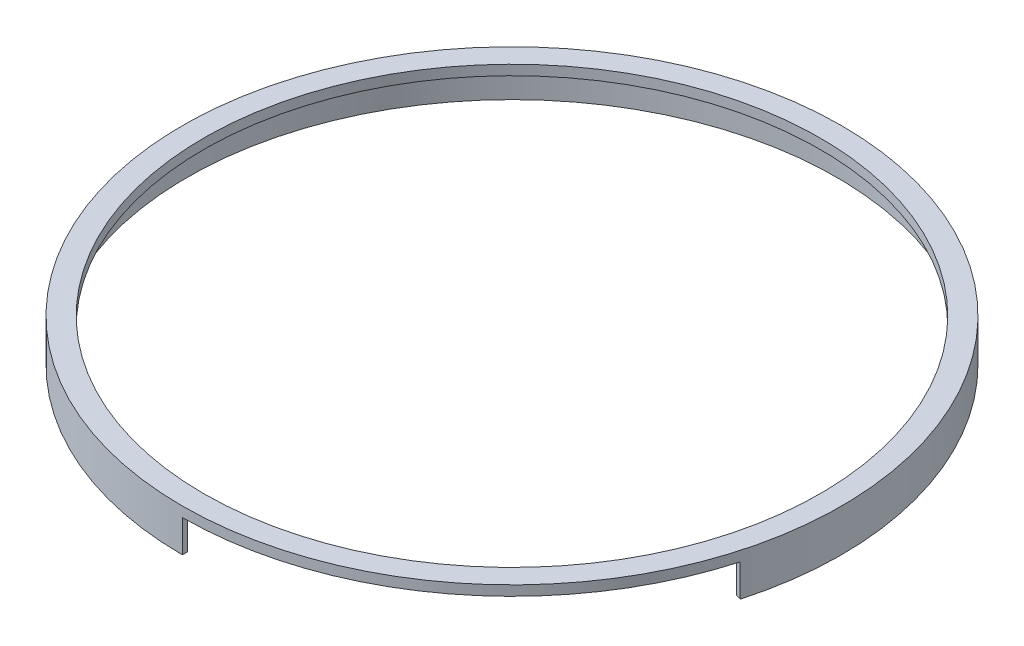
ISO-10303-21;
HEADER;
FILE_DESCRIPTION(('STEP AP214'),'2;1');
FILE_NAME('part.step','',(''),(''),'','','');
FILE_SCHEMA(('AUTOMOTIVE_DESIGN { 1 0 10303 214 1 1 1 1 }'));
ENDSEC;
DATA;
#1=APPLICATION_CONTEXT('core data for automotive mechanical design processes');
#2=APPLICATION_PROTOCOL_DEFINITION('international standard','automotive_design',2000,#1);
#3=PRODUCT_CONTEXT('',#1,'mechanical');
#4=PRODUCT('Part','Part','',(#3));
#5=PRODUCT_RELATED_PRODUCT_CATEGORY('part','',(#4));
#6=PRODUCT_DEFINITION_FORMATION('','',#4);
#7=PRODUCT_DEFINITION_CONTEXT('part definition',#1,'design');
#8=PRODUCT_DEFINITION('design','',#6,#7);
#9=PRODUCT_DEFINITION_SHAPE('','',#8);
#10=(LENGTH_UNIT() NAMED_UNIT(*) SI_UNIT(.MILLI.,.METRE.));
#11=(NAMED_UNIT(*) PLANE_ANGLE_UNIT() SI_UNIT($,.RADIAN.));
#12=(NAMED_UNIT(*) SI_UNIT($,.STERADIAN.) SOLID_ANGLE_UNIT());
#13=UNCERTAINTY_MEASURE_WITH_UNIT(LENGTH_MEASURE(1.E-05),#10,'distance_accuracy_value','');
#14=(GEOMETRIC_REPRESENTATION_CONTEXT(3) GLOBAL_UNCERTAINTY_ASSIGNED_CONTEXT((#13)) GLOBAL_UNIT_ASSIGNED_CONTEXT((#10,
#11,#12)) REPRESENTATION_CONTEXT('',''));
#15=CARTESIAN_POINT('',(0.,0.,0.));
#16=DIRECTION('',(0.,0.,1.));
#17=DIRECTION('',(1.,0.,0.));
#18=AXIS2_PLACEMENT_3D('',#15,#16,#17);
#19=CARTESIAN_POINT('',(0.,0.,0.));
#20=DIRECTION('',(0.,1.,0.));
#21=DIRECTION('',(0.,0.,1.));
#22=AXIS2_PLACEMENT_3D('',#19,#20,#21);
#23=PLANE('',#22);
#24=CARTESIAN_POINT('',(0.,0.,0.));
#25=DIRECTION('',(0.,1.,0.));
#26=DIRECTION('',(0.,0.,1.));
#27=AXIS2_PLACEMENT_3D('',#24,#25,#26);
#28=CIRCLE('',#27,62.);
#29=CARTESIAN_POINT('',(0.,0.,62.));
#30=VERTEX_POINT('',#29);
#31=EDGE_CURVE('E80',#30,#30,#28,.T.);
#32=ORIENTED_EDGE('',*,*,#31,.T.);
#33=EDGE_LOOP('',(#32));
#34=FACE_BOUND('',#33,.T.);
#35=DIRECTION('',(-0.962787641919989,0.,-0.270259054549792));
#36=VECTOR('',#35,1.);
#37=CARTESIAN_POINT('',(0.,0.,0.));
#38=LINE('',#37,#36);
#39=CARTESIAN_POINT('',(63.8328206592953,0.,17.9181753166513));
#40=VERTEX_POINT('',#39);
#41=CARTESIAN_POINT('',(62.8700330173753,0.,17.6479162621015));
#42=VERTEX_POINT('',#41);
#43=EDGE_CURVE('E95',#40,#42,#38,.T.);
#44=ORIENTED_EDGE('',*,*,#43,.F.);
#45=CARTESIAN_POINT('',(0.,0.,0.));
#46=DIRECTION('',(0.,1.,0.));
#47=DIRECTION('',(0.,0.,1.));
#48=AXIS2_PLACEMENT_3D('',#45,#46,#47);
#49=CIRCLE('',#48,66.3);
#50=CARTESIAN_POINT('',(0.,0.,66.3));
#51=VERTEX_POINT('',#50);
#52=EDGE_CURVE('E39',#51,#40,#49,.T.);
#53=ORIENTED_EDGE('',*,*,#52,.F.);
#54=DIRECTION('',(0.,0.,1.));
#55=VECTOR('',#54,1.);
#56=CARTESIAN_POINT('',(0.,0.,0.));
#57=LINE('',#56,#55);
#58=CARTESIAN_POINT('',(0.,0.,65.3));
#59=VERTEX_POINT('',#58);
#60=EDGE_CURVE('E55',#59,#51,#57,.T.);
#61=ORIENTED_EDGE('',*,*,#60,.F.);
#62=CARTESIAN_POINT('',(0.,0.,0.));
#63=DIRECTION('',(0.,-1.,0.));
#64=DIRECTION('',(0.,0.,-1.));
#65=AXIS2_PLACEMENT_3D('',#62,#63,#64);
#66=CIRCLE('',#65,65.3);
#67=EDGE_CURVE('E50',#59,#42,#66,.T.);
#68=ORIENTED_EDGE('',*,*,#67,.T.);
#69=EDGE_LOOP('',(#44,#53,#61,#68));
#70=FACE_BOUND('',#69,.T.);
#71=ADVANCED_FACE('F35',(#34,#70),#23,.F.);
#72=CARTESIAN_POINT('',(0.,2.,0.));
#73=DIRECTION('',(0.,1.,0.));
#74=DIRECTION('',(0.,0.,1.));
#75=AXIS2_PLACEMENT_3D('',#72,#73,#74);
#76=PLANE('',#75);
#77=CARTESIAN_POINT('',(0.,2.,0.));
#78=DIRECTION('',(0.,1.,0.));
#79=DIRECTION('',(0.,0.,1.));
#80=AXIS2_PLACEMENT_3D('',#77,#78,#79);
#81=CIRCLE('',#80,66.3);
#82=CARTESIAN_POINT('',(0.,2.,66.3));
#83=VERTEX_POINT('',#82);
#84=EDGE_CURVE('E11',#83,#83,#81,.T.);
#85=ORIENTED_EDGE('',*,*,#84,.T.);
#86=EDGE_LOOP('',(#85));
#87=FACE_BOUND('',#86,.T.);
#88=CARTESIAN_POINT('',(0.,2.,0.));
#89=DIRECTION('',(0.,1.,0.));
#90=DIRECTION('',(0.,0.,1.));
#91=AXIS2_PLACEMENT_3D('',#88,#89,#90);
#92=CIRCLE('',#91,62.);
#93=CARTESIAN_POINT('',(0.,2.,62.));
#94=VERTEX_POINT('',#93);
#95=EDGE_CURVE('E110',#94,#94,#92,.T.);
#96=ORIENTED_EDGE('',*,*,#95,.F.);
#97=EDGE_LOOP('',(#96));
#98=FACE_BOUND('',#97,.T.);
#99=ADVANCED_FACE('F126',(#87,#98),#76,.T.);
#100=CARTESIAN_POINT('',(0.,2.,0.));
#101=DIRECTION('',(0.,-1.,0.));
#102=DIRECTION('',(0.,0.,-1.));
#103=AXIS2_PLACEMENT_3D('',#100,#101,#102);
#104=CYLINDRICAL_SURFACE('',#103,66.3);
#105=ORIENTED_EDGE('',*,*,#84,.F.);
#106=EDGE_LOOP('',(#105));
#107=FACE_BOUND('',#106,.T.);
#108=ORIENTED_EDGE('',*,*,#52,.T.);
#109=DIRECTION('',(0.,1.,0.));
#110=VECTOR('',#109,1.);
#111=CARTESIAN_POINT('',(63.8328206592953,-6.5,17.9181753166513));
#112=LINE('',#111,#110);
#113=CARTESIAN_POINT('',(63.8328206592953,-6.5,17.9181753166513));
#114=VERTEX_POINT('',#113);
#115=EDGE_CURVE('E106',#114,#40,#112,.T.);
#116=ORIENTED_EDGE('',*,*,#115,.F.);
#117=CARTESIAN_POINT('',(0.,-6.5,0.));
#118=DIRECTION('',(0.,-1.,0.));
#119=DIRECTION('',(0.,0.,-1.));
#120=AXIS2_PLACEMENT_3D('',#117,#118,#119);
#121=CIRCLE('',#120,66.3);
#122=CARTESIAN_POINT('',(0.,-6.5,66.3));
#123=VERTEX_POINT('',#122);
#124=EDGE_CURVE('E89',#123,#114,#121,.T.);
#125=ORIENTED_EDGE('',*,*,#124,.F.);
#126=DIRECTION('',(0.,1.,0.));
#127=VECTOR('',#126,1.);
#128=CARTESIAN_POINT('',(0.,-6.5,66.3));
#129=LINE('',#128,#127);
#130=EDGE_CURVE('E81',#123,#51,#129,.T.);
#131=ORIENTED_EDGE('',*,*,#130,.T.);
#132=EDGE_LOOP('',(#108,#116,#125,#131));
#133=FACE_BOUND('',#132,.T.);
#134=ADVANCED_FACE('F37',(#107,#133),#104,.T.);
#135=CARTESIAN_POINT('',(0.,2.,0.));
#136=DIRECTION('',(0.,-1.,0.));
#137=DIRECTION('',(0.,0.,-1.));
#138=AXIS2_PLACEMENT_3D('',#135,#136,#137);
#139=CYLINDRICAL_SURFACE('',#138,62.);
#140=ORIENTED_EDGE('',*,*,#95,.T.);
#141=EDGE_LOOP('',(#140));
#142=FACE_BOUND('',#141,.T.);
#143=ORIENTED_EDGE('',*,*,#31,.F.);
#144=EDGE_LOOP('',(#143));
#145=FACE_BOUND('',#144,.T.);
#146=ADVANCED_FACE('F117',(#142,#145),#139,.F.);
#147=CARTESIAN_POINT('',(0.,-6.5,0.));
#148=DIRECTION('',(0.,1.,0.));
#149=DIRECTION('',(0.,0.,1.));
#150=AXIS2_PLACEMENT_3D('',#147,#148,#149);
#151=CYLINDRICAL_SURFACE('',#150,65.3);
#152=ORIENTED_EDGE('',*,*,#67,.F.);
#153=DIRECTION('',(0.,1.,0.));
#154=VECTOR('',#153,1.);
#155=CARTESIAN_POINT('',(0.,-6.5,65.3));
#156=LINE('',#155,#154);
#157=CARTESIAN_POINT('',(0.,-6.5,65.3));
#158=VERTEX_POINT('',#157);
#159=EDGE_CURVE('E74',#158,#59,#156,.T.);
#160=ORIENTED_EDGE('',*,*,#159,.F.);
#161=CARTESIAN_POINT('',(0.,-6.5,0.));
#162=DIRECTION('',(0.,-1.,0.));
#163=DIRECTION('',(0.,0.,-1.));
#164=AXIS2_PLACEMENT_3D('',#161,#162,#163);
#165=CIRCLE('',#164,65.3);
#166=CARTESIAN_POINT('',(62.8700330173753,-6.5,17.6479162621015));
#167=VERTEX_POINT('',#166);
#168=EDGE_CURVE('E78',#158,#167,#165,.T.);
#169=ORIENTED_EDGE('',*,*,#168,.T.);
#170=DIRECTION('',(0.,1.,0.));
#171=VECTOR('',#170,1.);
#172=CARTESIAN_POINT('',(62.8700330173753,-6.5,17.6479162621015));
#173=LINE('',#172,#171);
#174=EDGE_CURVE('E102',#167,#42,#173,.T.);
#175=ORIENTED_EDGE('',*,*,#174,.T.);
#176=EDGE_LOOP('',(#152,#160,#169,#175));
#177=FACE_BOUND('',#176,.T.);
#178=ADVANCED_FACE('F76',(#177),#151,.F.);
#179=CARTESIAN_POINT('',(0.,-6.5,0.));
#180=DIRECTION('',(-1.,0.,0.));
#181=DIRECTION('',(0.,0.,1.));
#182=AXIS2_PLACEMENT_3D('',#179,#180,#181);
#183=PLANE('',#182);
#184=ORIENTED_EDGE('',*,*,#60,.T.);
#185=ORIENTED_EDGE('',*,*,#130,.F.);
#186=DIRECTION('',(0.,0.,1.));
#187=VECTOR('',#186,1.);
#188=CARTESIAN_POINT('',(0.,-6.5,0.));
#189=LINE('',#188,#187);
#190=EDGE_CURVE('E84',#158,#123,#189,.T.);
#191=ORIENTED_EDGE('',*,*,#190,.F.);
#192=ORIENTED_EDGE('',*,*,#159,.T.);
#193=EDGE_LOOP('',(#184,#185,#191,#192));
#194=FACE_BOUND('',#193,.T.);
#195=ADVANCED_FACE('F85',(#194),#183,.F.);
#196=CARTESIAN_POINT('',(0.,-6.5,0.));
#197=DIRECTION('',(0.270259054549792,0.,-0.962787641919989));
#198=DIRECTION('',(-0.962787641919989,0.,-0.270259054549792));
#199=AXIS2_PLACEMENT_3D('',#196,#197,#198);
#200=PLANE('',#199);
#201=ORIENTED_EDGE('',*,*,#43,.T.);
#202=ORIENTED_EDGE('',*,*,#174,.F.);
#203=DIRECTION('',(-0.962787641919989,0.,-0.270259054549792));
#204=VECTOR('',#203,1.);
#205=CARTESIAN_POINT('',(0.,-6.5,0.));
#206=LINE('',#205,#204);
#207=EDGE_CURVE('E93',#114,#167,#206,.T.);
#208=ORIENTED_EDGE('',*,*,#207,.F.);
#209=ORIENTED_EDGE('',*,*,#115,.T.);
#210=EDGE_LOOP('',(#201,#202,#208,#209));
#211=FACE_BOUND('',#210,.T.);
#212=ADVANCED_FACE('F143',(#211),#200,.F.);
#213=CARTESIAN_POINT('',(0.,-6.5,0.));
#214=DIRECTION('',(0.,-1.,0.));
#215=DIRECTION('',(0.,0.,-1.));
#216=AXIS2_PLACEMENT_3D('',#213,#214,#215);
#217=PLANE('',#216);
#218=ORIENTED_EDGE('',*,*,#168,.F.);
#219=ORIENTED_EDGE('',*,*,#190,.T.);
#220=ORIENTED_EDGE('',*,*,#124,.T.);
#221=ORIENTED_EDGE('',*,*,#207,.T.);
#222=EDGE_LOOP('',(#218,#219,#220,#221));
#223=FACE_BOUND('',#222,.T.);
#224=ADVANCED_FACE('F91',(#223),#217,.T.);
#225=CLOSED_SHELL('',(#71,#99,#134,#146,#178,#195,#212,#224));
#226=MANIFOLD_SOLID_BREP('B2',#225);
#227=ADVANCED_BREP_SHAPE_REPRESENTATION('',(#18,#226),#14);
#228=SHAPE_DEFINITION_REPRESENTATION(#9,#227);
ENDSEC;
END-ISO-10303-21;
